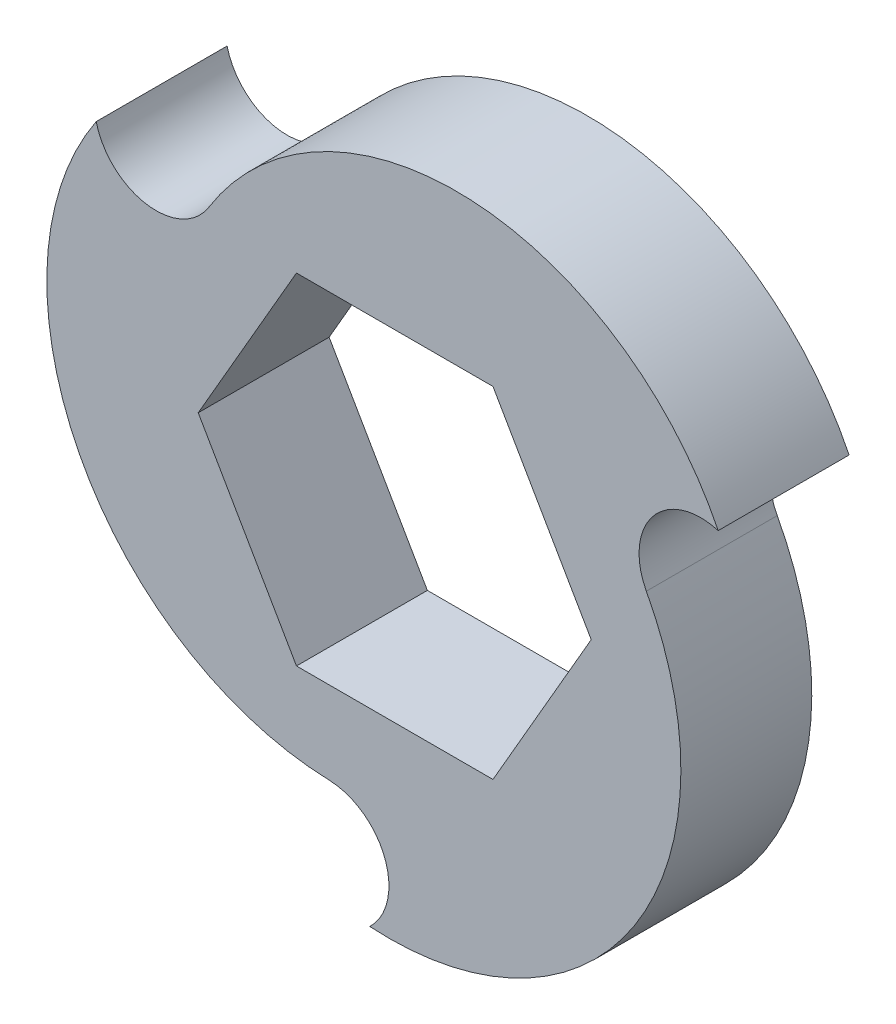
ISO-10303-21;
HEADER;
FILE_DESCRIPTION(('STEP AP214'),'2;1');
FILE_NAME('part.step','',(''),(''),'','','');
FILE_SCHEMA(('AUTOMOTIVE_DESIGN { 1 0 10303 214 1 1 1 1 }'));
ENDSEC;
DATA;
#1=APPLICATION_CONTEXT('core data for automotive mechanical design processes');
#2=APPLICATION_PROTOCOL_DEFINITION('international standard','automotive_design',2000,#1);
#3=PRODUCT_CONTEXT('',#1,'mechanical');
#4=PRODUCT('Part','Part','',(#3));
#5=PRODUCT_RELATED_PRODUCT_CATEGORY('part','',(#4));
#6=PRODUCT_DEFINITION_FORMATION('','',#4);
#7=PRODUCT_DEFINITION_CONTEXT('part definition',#1,'design');
#8=PRODUCT_DEFINITION('design','',#6,#7);
#9=PRODUCT_DEFINITION_SHAPE('','',#8);
#10=(LENGTH_UNIT() NAMED_UNIT(*) SI_UNIT(.MILLI.,.METRE.));
#11=(NAMED_UNIT(*) PLANE_ANGLE_UNIT() SI_UNIT($,.RADIAN.));
#12=(NAMED_UNIT(*) SI_UNIT($,.STERADIAN.) SOLID_ANGLE_UNIT());
#13=UNCERTAINTY_MEASURE_WITH_UNIT(LENGTH_MEASURE(1.E-05),#10,'distance_accuracy_value','');
#14=(GEOMETRIC_REPRESENTATION_CONTEXT(3) GLOBAL_UNCERTAINTY_ASSIGNED_CONTEXT((#13)) GLOBAL_UNIT_ASSIGNED_CONTEXT((#10,
#11,#12)) REPRESENTATION_CONTEXT('',''));
#15=CARTESIAN_POINT('',(0.,0.,0.));
#16=DIRECTION('',(0.,0.,1.));
#17=DIRECTION('',(1.,0.,0.));
#18=AXIS2_PLACEMENT_3D('',#15,#16,#17);
#19=CARTESIAN_POINT('',(-1.39494313142005,-7.3057337522295,5.));
#20=DIRECTION('',(0.,0.,-1.));
#21=DIRECTION('',(-1.,0.,0.));
#22=AXIS2_PLACEMENT_3D('',#19,#20,#21);
#23=PLANE('',#22);
#24=CARTESIAN_POINT('',(-0.209275396929008,-2.60204479361401,5.));
#25=DIRECTION('',(0.,0.,1.));
#26=DIRECTION('',(-1.,0.,0.));
#27=AXIS2_PLACEMENT_3D('',#24,#25,#26);
#28=CIRCLE('',#27,11.1397436958321);
#29=CARTESIAN_POINT('',(-0.953157803575311,-13.7169234962321,5.));
#30=VERTEX_POINT('',#29);
#31=CARTESIAN_POINT('',(9.61126501862957,2.65636518994684,5.));
#32=VERTEX_POINT('',#31);
#33=EDGE_CURVE('E200',#30,#32,#28,.T.);
#34=ORIENTED_EDGE('',*,*,#33,.T.);
#35=CARTESIAN_POINT('',(11.6907705853331,3.76983678826125,5.));
#36=DIRECTION('',(0.,0.,-1.));
#37=DIRECTION('',(1.,0.,0.));
#38=AXIS2_PLACEMENT_3D('',#35,#36,#37);
#39=CIRCLE('',#38,2.35884768524883);
#40=CARTESIAN_POINT('',(12.3557831112923,6.03300287640438,5.));
#41=VERTEX_POINT('',#40);
#42=EDGE_CURVE('E204',#32,#41,#39,.T.);
#43=ORIENTED_EDGE('',*,*,#42,.T.);
#44=CARTESIAN_POINT('',(2.3580745915193,1.11978458667937,5.));
#45=DIRECTION('',(0.,0.,1.));
#46=DIRECTION('',(-1.,0.,0.));
#47=AXIS2_PLACEMENT_3D('',#44,#45,#46);
#48=CIRCLE('',#47,11.1397436958321);
#49=CARTESIAN_POINT('',(-7.10611224553738,6.99541707366444,5.));
#50=VERTEX_POINT('',#49);
#51=EDGE_CURVE('E208',#41,#50,#48,.T.);
#52=ORIENTED_EDGE('',*,*,#51,.T.);
#53=CARTESIAN_POINT('',(-9.11015971942193,8.23958592258361,5.));
#54=DIRECTION('',(0.,0.,-1.));
#55=DIRECTION('',(1.,0.,0.));
#56=AXIS2_PLACEMENT_3D('',#53,#54,#55);
#57=CIRCLE('',#56,2.35884768524882);
#58=CARTESIAN_POINT('',(-11.402625307717,7.68392061982767,5.));
#59=VERTEX_POINT('',#58);
#60=EDGE_CURVE('E211',#50,#59,#57,.T.);
#61=ORIENTED_EDGE('',*,*,#60,.T.);
#62=CARTESIAN_POINT('',(-2.14879919459025,1.48226020693456,5.));
#63=DIRECTION('',(0.,0.,1.));
#64=DIRECTION('',(-1.,0.,0.));
#65=AXIS2_PLACEMENT_3D('',#62,#63,#64);
#66=CIRCLE('',#65,11.1397436958321);
#67=CARTESIAN_POINT('',(-2.50515277309212,-9.65178226361135,5.));
#68=VERTEX_POINT('',#67);
#69=EDGE_CURVE('E214',#59,#68,#66,.T.);
#70=ORIENTED_EDGE('',*,*,#69,.T.);
#71=CARTESIAN_POINT('',(-2.58061086591109,-12.009422710845,5.));
#72=DIRECTION('',(0.,0.,-1.));
#73=DIRECTION('',(1.,0.,0.));
#74=AXIS2_PLACEMENT_3D('',#71,#72,#73);
#75=CIRCLE('',#74,2.35884768524883);
#76=EDGE_CURVE('E217',#68,#30,#75,.T.);
#77=ORIENTED_EDGE('',*,*,#76,.T.);
#78=EDGE_LOOP('',(#34,#43,#52,#61,#70,#77));
#79=FACE_BOUND('',#78,.T.);
#80=DIRECTION('',(0.5,0.866025403784438,0.));
#81=VECTOR('',#80,1.);
#82=CARTESIAN_POINT('',(3.75277674973256,-6.5,5.));
#83=LINE('',#82,#81);
#84=CARTESIAN_POINT('',(3.75277674973256,-6.5,5.));
#85=VERTEX_POINT('',#84);
#86=CARTESIAN_POINT('',(7.50555349946513,0.,5.));
#87=VERTEX_POINT('',#86);
#88=EDGE_CURVE('E131',#85,#87,#83,.T.);
#89=ORIENTED_EDGE('',*,*,#88,.F.);
#90=DIRECTION('',(1.,0.,0.));
#91=VECTOR('',#90,1.);
#92=CARTESIAN_POINT('',(-3.75277674973257,-6.5,5.));
#93=LINE('',#92,#91);
#94=CARTESIAN_POINT('',(-3.75277674973257,-6.5,5.));
#95=VERTEX_POINT('',#94);
#96=EDGE_CURVE('E166',#95,#85,#93,.T.);
#97=ORIENTED_EDGE('',*,*,#96,.F.);
#98=DIRECTION('',(0.5,-0.866025403784439,0.));
#99=VECTOR('',#98,1.);
#100=CARTESIAN_POINT('',(-7.50555349946513,0.,5.));
#101=LINE('',#100,#99);
#102=CARTESIAN_POINT('',(-7.50555349946513,0.,5.));
#103=VERTEX_POINT('',#102);
#104=EDGE_CURVE('E163',#103,#95,#101,.T.);
#105=ORIENTED_EDGE('',*,*,#104,.F.);
#106=DIRECTION('',(-0.500000000000001,-0.866025403784438,0.));
#107=VECTOR('',#106,1.);
#108=CARTESIAN_POINT('',(-3.75277674973256,6.5,5.));
#109=LINE('',#108,#107);
#110=CARTESIAN_POINT('',(-3.75277674973256,6.5,5.));
#111=VERTEX_POINT('',#110);
#112=EDGE_CURVE('E158',#111,#103,#109,.T.);
#113=ORIENTED_EDGE('',*,*,#112,.F.);
#114=DIRECTION('',(-1.,0.,0.));
#115=VECTOR('',#114,1.);
#116=CARTESIAN_POINT('',(3.75277674973257,6.5,5.));
#117=LINE('',#116,#115);
#118=CARTESIAN_POINT('',(3.75277674973257,6.5,5.));
#119=VERTEX_POINT('',#118);
#120=EDGE_CURVE('E154',#119,#111,#117,.T.);
#121=ORIENTED_EDGE('',*,*,#120,.F.);
#122=DIRECTION('',(-0.5,0.866025403784439,0.));
#123=VECTOR('',#122,1.);
#124=CARTESIAN_POINT('',(7.50555349946513,0.,5.));
#125=LINE('',#124,#123);
#126=EDGE_CURVE('E140',#87,#119,#125,.T.);
#127=ORIENTED_EDGE('',*,*,#126,.F.);
#128=EDGE_LOOP('',(#89,#97,#105,#113,#121,#127));
#129=FACE_BOUND('',#128,.T.);
#130=ADVANCED_FACE('F41',(#79,#129),#23,.F.);
#131=CARTESIAN_POINT('',(-1.39494313142005,-7.3057337522295,0.));
#132=DIRECTION('',(0.,0.,-1.));
#133=DIRECTION('',(-1.,0.,0.));
#134=AXIS2_PLACEMENT_3D('',#131,#132,#133);
#135=PLANE('',#134);
#136=CARTESIAN_POINT('',(-0.209275396929008,-2.60204479361401,0.));
#137=DIRECTION('',(0.,0.,1.));
#138=DIRECTION('',(-1.,0.,0.));
#139=AXIS2_PLACEMENT_3D('',#136,#137,#138);
#140=CIRCLE('',#139,11.1397436958321);
#141=CARTESIAN_POINT('',(-0.953157803575311,-13.7169234962321,0.));
#142=VERTEX_POINT('',#141);
#143=CARTESIAN_POINT('',(9.61126501862957,2.65636518994684,0.));
#144=VERTEX_POINT('',#143);
#145=EDGE_CURVE('E149',#142,#144,#140,.T.);
#146=ORIENTED_EDGE('',*,*,#145,.F.);
#147=CARTESIAN_POINT('',(-2.58061086591109,-12.009422710845,0.));
#148=DIRECTION('',(0.,0.,-1.));
#149=DIRECTION('',(1.,0.,0.));
#150=AXIS2_PLACEMENT_3D('',#147,#148,#149);
#151=CIRCLE('',#150,2.35884768524883);
#152=CARTESIAN_POINT('',(-2.50515277309212,-9.65178226361135,0.));
#153=VERTEX_POINT('',#152);
#154=EDGE_CURVE('E205',#153,#142,#151,.T.);
#155=ORIENTED_EDGE('',*,*,#154,.F.);
#156=CARTESIAN_POINT('',(-2.14879919459025,1.48226020693456,0.));
#157=DIRECTION('',(0.,0.,1.));
#158=DIRECTION('',(-1.,0.,0.));
#159=AXIS2_PLACEMENT_3D('',#156,#157,#158);
#160=CIRCLE('',#159,11.1397436958321);
#161=CARTESIAN_POINT('',(-11.402625307717,7.68392061982767,0.));
#162=VERTEX_POINT('',#161);
#163=EDGE_CURVE('E233',#162,#153,#160,.T.);
#164=ORIENTED_EDGE('',*,*,#163,.F.);
#165=CARTESIAN_POINT('',(-9.11015971942193,8.23958592258361,0.));
#166=DIRECTION('',(0.,0.,-1.));
#167=DIRECTION('',(1.,0.,0.));
#168=AXIS2_PLACEMENT_3D('',#165,#166,#167);
#169=CIRCLE('',#168,2.35884768524882);
#170=CARTESIAN_POINT('',(-7.10611224553738,6.99541707366444,0.));
#171=VERTEX_POINT('',#170);
#172=EDGE_CURVE('E230',#171,#162,#169,.T.);
#173=ORIENTED_EDGE('',*,*,#172,.F.);
#174=CARTESIAN_POINT('',(2.3580745915193,1.11978458667937,0.));
#175=DIRECTION('',(0.,0.,1.));
#176=DIRECTION('',(-1.,0.,0.));
#177=AXIS2_PLACEMENT_3D('',#174,#175,#176);
#178=CIRCLE('',#177,11.1397436958321);
#179=CARTESIAN_POINT('',(12.3557831112923,6.03300287640438,0.));
#180=VERTEX_POINT('',#179);
#181=EDGE_CURVE('E227',#180,#171,#178,.T.);
#182=ORIENTED_EDGE('',*,*,#181,.F.);
#183=CARTESIAN_POINT('',(11.6907705853331,3.76983678826125,0.));
#184=DIRECTION('',(0.,0.,-1.));
#185=DIRECTION('',(1.,0.,0.));
#186=AXIS2_PLACEMENT_3D('',#183,#184,#185);
#187=CIRCLE('',#186,2.35884768524883);
#188=EDGE_CURVE('E224',#144,#180,#187,.T.);
#189=ORIENTED_EDGE('',*,*,#188,.F.);
#190=EDGE_LOOP('',(#146,#155,#164,#173,#182,#189));
#191=FACE_BOUND('',#190,.T.);
#192=DIRECTION('',(1.,0.,0.));
#193=VECTOR('',#192,1.);
#194=CARTESIAN_POINT('',(-3.75277674973257,-6.5,0.));
#195=LINE('',#194,#193);
#196=CARTESIAN_POINT('',(-3.75277674973257,-6.5,0.));
#197=VERTEX_POINT('',#196);
#198=CARTESIAN_POINT('',(3.75277674973256,-6.5,0.));
#199=VERTEX_POINT('',#198);
#200=EDGE_CURVE('E141',#197,#199,#195,.T.);
#201=ORIENTED_EDGE('',*,*,#200,.T.);
#202=DIRECTION('',(0.5,0.866025403784438,0.));
#203=VECTOR('',#202,1.);
#204=CARTESIAN_POINT('',(3.75277674973256,-6.5,0.));
#205=LINE('',#204,#203);
#206=CARTESIAN_POINT('',(7.50555349946513,0.,0.));
#207=VERTEX_POINT('',#206);
#208=EDGE_CURVE('E65',#199,#207,#205,.T.);
#209=ORIENTED_EDGE('',*,*,#208,.T.);
#210=DIRECTION('',(-0.5,0.866025403784439,0.));
#211=VECTOR('',#210,1.);
#212=CARTESIAN_POINT('',(7.50555349946513,0.,0.));
#213=LINE('',#212,#211);
#214=CARTESIAN_POINT('',(3.75277674973257,6.5,0.));
#215=VERTEX_POINT('',#214);
#216=EDGE_CURVE('E147',#207,#215,#213,.T.);
#217=ORIENTED_EDGE('',*,*,#216,.T.);
#218=DIRECTION('',(-1.,0.,0.));
#219=VECTOR('',#218,1.);
#220=CARTESIAN_POINT('',(3.75277674973257,6.5,0.));
#221=LINE('',#220,#219);
#222=CARTESIAN_POINT('',(-3.75277674973256,6.5,0.));
#223=VERTEX_POINT('',#222);
#224=EDGE_CURVE('E173',#215,#223,#221,.T.);
#225=ORIENTED_EDGE('',*,*,#224,.T.);
#226=DIRECTION('',(-0.500000000000001,-0.866025403784438,0.));
#227=VECTOR('',#226,1.);
#228=CARTESIAN_POINT('',(-3.75277674973256,6.5,0.));
#229=LINE('',#228,#227);
#230=CARTESIAN_POINT('',(-7.50555349946513,0.,0.));
#231=VERTEX_POINT('',#230);
#232=EDGE_CURVE('E177',#223,#231,#229,.T.);
#233=ORIENTED_EDGE('',*,*,#232,.T.);
#234=DIRECTION('',(0.5,-0.866025403784439,0.));
#235=VECTOR('',#234,1.);
#236=CARTESIAN_POINT('',(-7.50555349946513,0.,0.));
#237=LINE('',#236,#235);
#238=EDGE_CURVE('E181',#231,#197,#237,.T.);
#239=ORIENTED_EDGE('',*,*,#238,.T.);
#240=EDGE_LOOP('',(#201,#209,#217,#225,#233,#239));
#241=FACE_BOUND('',#240,.T.);
#242=ADVANCED_FACE('F264',(#191,#241),#135,.T.);
#243=CARTESIAN_POINT('',(-0.209275396929008,-2.60204479361401,5.));
#244=DIRECTION('',(0.,0.,-1.));
#245=DIRECTION('',(-1.,0.,0.));
#246=AXIS2_PLACEMENT_3D('',#243,#244,#245);
#247=CYLINDRICAL_SURFACE('',#246,11.1397436958321);
#248=ORIENTED_EDGE('',*,*,#145,.T.);
#249=DIRECTION('',(0.,0.,-1.));
#250=VECTOR('',#249,1.);
#251=CARTESIAN_POINT('',(9.61126501862957,2.65636518994684,5.));
#252=LINE('',#251,#250);
#253=EDGE_CURVE('E11',#32,#144,#252,.T.);
#254=ORIENTED_EDGE('',*,*,#253,.F.);
#255=ORIENTED_EDGE('',*,*,#33,.F.);
#256=DIRECTION('',(0.,0.,-1.));
#257=VECTOR('',#256,1.);
#258=CARTESIAN_POINT('',(-0.953157803575311,-13.7169234962321,5.));
#259=LINE('',#258,#257);
#260=EDGE_CURVE('E220',#30,#142,#259,.T.);
#261=ORIENTED_EDGE('',*,*,#260,.T.);
#262=EDGE_LOOP('',(#248,#254,#255,#261));
#263=FACE_BOUND('',#262,.T.);
#264=ADVANCED_FACE('F43',(#263),#247,.T.);
#265=CARTESIAN_POINT('',(11.6907705853331,3.76983678826125,5.));
#266=DIRECTION('',(0.,0.,-1.));
#267=DIRECTION('',(-1.,0.,0.));
#268=AXIS2_PLACEMENT_3D('',#265,#266,#267);
#269=CYLINDRICAL_SURFACE('',#268,2.35884768524883);
#270=ORIENTED_EDGE('',*,*,#188,.T.);
#271=DIRECTION('',(0.,0.,-1.));
#272=VECTOR('',#271,1.);
#273=CARTESIAN_POINT('',(12.3557831112923,6.03300287640438,5.));
#274=LINE('',#273,#272);
#275=EDGE_CURVE('E50',#41,#180,#274,.T.);
#276=ORIENTED_EDGE('',*,*,#275,.F.);
#277=ORIENTED_EDGE('',*,*,#42,.F.);
#278=ORIENTED_EDGE('',*,*,#253,.T.);
#279=EDGE_LOOP('',(#270,#276,#277,#278));
#280=FACE_BOUND('',#279,.T.);
#281=ADVANCED_FACE('F281',(#280),#269,.F.);
#282=CARTESIAN_POINT('',(2.3580745915193,1.11978458667937,5.));
#283=DIRECTION('',(0.,0.,-1.));
#284=DIRECTION('',(-1.,0.,0.));
#285=AXIS2_PLACEMENT_3D('',#282,#283,#284);
#286=CYLINDRICAL_SURFACE('',#285,11.1397436958321);
#287=ORIENTED_EDGE('',*,*,#181,.T.);
#288=DIRECTION('',(0.,0.,-1.));
#289=VECTOR('',#288,1.);
#290=CARTESIAN_POINT('',(-7.10611224553738,6.99541707366444,5.));
#291=LINE('',#290,#289);
#292=EDGE_CURVE('E249',#50,#171,#291,.T.);
#293=ORIENTED_EDGE('',*,*,#292,.F.);
#294=ORIENTED_EDGE('',*,*,#51,.F.);
#295=ORIENTED_EDGE('',*,*,#275,.T.);
#296=EDGE_LOOP('',(#287,#293,#294,#295));
#297=FACE_BOUND('',#296,.T.);
#298=ADVANCED_FACE('F258',(#297),#286,.T.);
#299=CARTESIAN_POINT('',(-9.11015971942193,8.23958592258361,5.));
#300=DIRECTION('',(0.,0.,-1.));
#301=DIRECTION('',(-1.,0.,0.));
#302=AXIS2_PLACEMENT_3D('',#299,#300,#301);
#303=CYLINDRICAL_SURFACE('',#302,2.35884768524882);
#304=ORIENTED_EDGE('',*,*,#172,.T.);
#305=DIRECTION('',(0.,0.,-1.));
#306=VECTOR('',#305,1.);
#307=CARTESIAN_POINT('',(-11.402625307717,7.68392061982767,5.));
#308=LINE('',#307,#306);
#309=EDGE_CURVE('E245',#59,#162,#308,.T.);
#310=ORIENTED_EDGE('',*,*,#309,.F.);
#311=ORIENTED_EDGE('',*,*,#60,.F.);
#312=ORIENTED_EDGE('',*,*,#292,.T.);
#313=EDGE_LOOP('',(#304,#310,#311,#312));
#314=FACE_BOUND('',#313,.T.);
#315=ADVANCED_FACE('F270',(#314),#303,.F.);
#316=CARTESIAN_POINT('',(-2.14879919459025,1.48226020693456,5.));
#317=DIRECTION('',(0.,0.,-1.));
#318=DIRECTION('',(-1.,0.,0.));
#319=AXIS2_PLACEMENT_3D('',#316,#317,#318);
#320=CYLINDRICAL_SURFACE('',#319,11.1397436958321);
#321=ORIENTED_EDGE('',*,*,#163,.T.);
#322=DIRECTION('',(0.,0.,-1.));
#323=VECTOR('',#322,1.);
#324=CARTESIAN_POINT('',(-2.50515277309212,-9.65178226361135,5.));
#325=LINE('',#324,#323);
#326=EDGE_CURVE('E241',#68,#153,#325,.T.);
#327=ORIENTED_EDGE('',*,*,#326,.F.);
#328=ORIENTED_EDGE('',*,*,#69,.F.);
#329=ORIENTED_EDGE('',*,*,#309,.T.);
#330=EDGE_LOOP('',(#321,#327,#328,#329));
#331=FACE_BOUND('',#330,.T.);
#332=ADVANCED_FACE('F274',(#331),#320,.T.);
#333=CARTESIAN_POINT('',(-2.58061086591109,-12.009422710845,5.));
#334=DIRECTION('',(0.,0.,-1.));
#335=DIRECTION('',(-1.,0.,0.));
#336=AXIS2_PLACEMENT_3D('',#333,#334,#335);
#337=CYLINDRICAL_SURFACE('',#336,2.35884768524883);
#338=ORIENTED_EDGE('',*,*,#154,.T.);
#339=ORIENTED_EDGE('',*,*,#260,.F.);
#340=ORIENTED_EDGE('',*,*,#76,.F.);
#341=ORIENTED_EDGE('',*,*,#326,.T.);
#342=EDGE_LOOP('',(#338,#339,#340,#341));
#343=FACE_BOUND('',#342,.T.);
#344=ADVANCED_FACE('F284',(#343),#337,.F.);
#345=CARTESIAN_POINT('',(3.75277674973256,-6.5,5.));
#346=DIRECTION('',(-0.866025403784438,0.5,0.));
#347=DIRECTION('',(-0.5,-0.866025403784438,0.));
#348=AXIS2_PLACEMENT_3D('',#345,#346,#347);
#349=PLANE('',#348);
#350=ORIENTED_EDGE('',*,*,#208,.F.);
#351=DIRECTION('',(0.,0.,-1.));
#352=VECTOR('',#351,1.);
#353=CARTESIAN_POINT('',(3.75277674973256,-6.5,5.));
#354=LINE('',#353,#352);
#355=EDGE_CURVE('E135',#85,#199,#354,.T.);
#356=ORIENTED_EDGE('',*,*,#355,.F.);
#357=ORIENTED_EDGE('',*,*,#88,.T.);
#358=DIRECTION('',(0.,0.,-1.));
#359=VECTOR('',#358,1.);
#360=CARTESIAN_POINT('',(7.50555349946513,0.,5.));
#361=LINE('',#360,#359);
#362=EDGE_CURVE('E134',#87,#207,#361,.T.);
#363=ORIENTED_EDGE('',*,*,#362,.T.);
#364=EDGE_LOOP('',(#350,#356,#357,#363));
#365=FACE_BOUND('',#364,.T.);
#366=ADVANCED_FACE('F133',(#365),#349,.T.);
#367=CARTESIAN_POINT('',(7.50555349946513,0.,5.));
#368=DIRECTION('',(-0.866025403784439,-0.5,0.));
#369=DIRECTION('',(0.5,-0.866025403784439,0.));
#370=AXIS2_PLACEMENT_3D('',#367,#368,#369);
#371=PLANE('',#370);
#372=ORIENTED_EDGE('',*,*,#216,.F.);
#373=ORIENTED_EDGE('',*,*,#362,.F.);
#374=ORIENTED_EDGE('',*,*,#126,.T.);
#375=DIRECTION('',(0.,0.,-1.));
#376=VECTOR('',#375,1.);
#377=CARTESIAN_POINT('',(3.75277674973257,6.5,5.));
#378=LINE('',#377,#376);
#379=EDGE_CURVE('E150',#119,#215,#378,.T.);
#380=ORIENTED_EDGE('',*,*,#379,.T.);
#381=EDGE_LOOP('',(#372,#373,#374,#380));
#382=FACE_BOUND('',#381,.T.);
#383=ADVANCED_FACE('F144',(#382),#371,.T.);
#384=CARTESIAN_POINT('',(3.75277674973257,6.5,5.));
#385=DIRECTION('',(0.,-1.,0.));
#386=DIRECTION('',(1.,0.,0.));
#387=AXIS2_PLACEMENT_3D('',#384,#385,#386);
#388=PLANE('',#387);
#389=ORIENTED_EDGE('',*,*,#224,.F.);
#390=ORIENTED_EDGE('',*,*,#379,.F.);
#391=ORIENTED_EDGE('',*,*,#120,.T.);
#392=DIRECTION('',(0.,0.,-1.));
#393=VECTOR('',#392,1.);
#394=CARTESIAN_POINT('',(-3.75277674973256,6.5,5.));
#395=LINE('',#394,#393);
#396=EDGE_CURVE('E195',#111,#223,#395,.T.);
#397=ORIENTED_EDGE('',*,*,#396,.T.);
#398=EDGE_LOOP('',(#389,#390,#391,#397));
#399=FACE_BOUND('',#398,.T.);
#400=ADVANCED_FACE('F302',(#399),#388,.T.);
#401=CARTESIAN_POINT('',(-3.75277674973256,6.5,5.));
#402=DIRECTION('',(0.866025403784438,-0.500000000000001,0.));
#403=DIRECTION('',(0.500000000000001,0.866025403784438,0.));
#404=AXIS2_PLACEMENT_3D('',#401,#402,#403);
#405=PLANE('',#404);
#406=ORIENTED_EDGE('',*,*,#232,.F.);
#407=ORIENTED_EDGE('',*,*,#396,.F.);
#408=ORIENTED_EDGE('',*,*,#112,.T.);
#409=DIRECTION('',(0.,0.,-1.));
#410=VECTOR('',#409,1.);
#411=CARTESIAN_POINT('',(-7.50555349946513,0.,5.));
#412=LINE('',#411,#410);
#413=EDGE_CURVE('E192',#103,#231,#412,.T.);
#414=ORIENTED_EDGE('',*,*,#413,.T.);
#415=EDGE_LOOP('',(#406,#407,#408,#414));
#416=FACE_BOUND('',#415,.T.);
#417=ADVANCED_FACE('F305',(#416),#405,.T.);
#418=CARTESIAN_POINT('',(-7.50555349946513,0.,5.));
#419=DIRECTION('',(0.866025403784439,0.5,0.));
#420=DIRECTION('',(-0.5,0.866025403784439,0.));
#421=AXIS2_PLACEMENT_3D('',#418,#419,#420);
#422=PLANE('',#421);
#423=ORIENTED_EDGE('',*,*,#238,.F.);
#424=ORIENTED_EDGE('',*,*,#413,.F.);
#425=ORIENTED_EDGE('',*,*,#104,.T.);
#426=DIRECTION('',(0.,0.,-1.));
#427=VECTOR('',#426,1.);
#428=CARTESIAN_POINT('',(-3.75277674973257,-6.5,5.));
#429=LINE('',#428,#427);
#430=EDGE_CURVE('E57',#95,#197,#429,.T.);
#431=ORIENTED_EDGE('',*,*,#430,.T.);
#432=EDGE_LOOP('',(#423,#424,#425,#431));
#433=FACE_BOUND('',#432,.T.);
#434=ADVANCED_FACE('F309',(#433),#422,.T.);
#435=CARTESIAN_POINT('',(-3.75277674973257,-6.5,5.));
#436=DIRECTION('',(0.,1.,0.));
#437=DIRECTION('',(-1.,0.,0.));
#438=AXIS2_PLACEMENT_3D('',#435,#436,#437);
#439=PLANE('',#438);
#440=ORIENTED_EDGE('',*,*,#200,.F.);
#441=ORIENTED_EDGE('',*,*,#430,.F.);
#442=ORIENTED_EDGE('',*,*,#96,.T.);
#443=ORIENTED_EDGE('',*,*,#355,.T.);
#444=EDGE_LOOP('',(#440,#441,#442,#443));
#445=FACE_BOUND('',#444,.T.);
#446=ADVANCED_FACE('F313',(#445),#439,.T.);
#447=CLOSED_SHELL('',(#130,#242,#264,#281,#298,#315,#332,#344,#366,#383,#400,#417,#434,#446));
#448=MANIFOLD_SOLID_BREP('B2',#447);
#449=ADVANCED_BREP_SHAPE_REPRESENTATION('',(#18,#448),#14);
#450=SHAPE_DEFINITION_REPRESENTATION(#9,#449);
ENDSEC;
END-ISO-10303-21;
